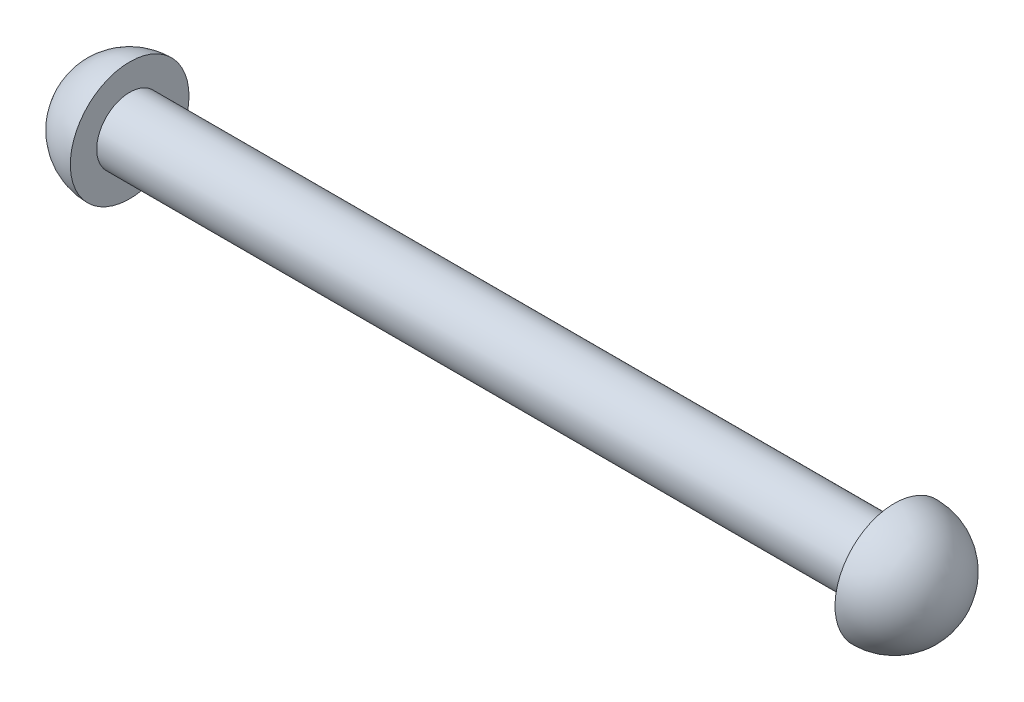
ISO-10303-21;
HEADER;
FILE_DESCRIPTION(('STEP AP214'),'2;1');
FILE_NAME('part.step','',(''),(''),'','','');
FILE_SCHEMA(('AUTOMOTIVE_DESIGN { 1 0 10303 214 1 1 1 1 }'));
ENDSEC;
DATA;
#1=APPLICATION_CONTEXT('core data for automotive mechanical design processes');
#2=APPLICATION_PROTOCOL_DEFINITION('international standard','automotive_design',2000,#1);
#3=PRODUCT_CONTEXT('',#1,'mechanical');
#4=PRODUCT('Part','Part','',(#3));
#5=PRODUCT_RELATED_PRODUCT_CATEGORY('part','',(#4));
#6=PRODUCT_DEFINITION_FORMATION('','',#4);
#7=PRODUCT_DEFINITION_CONTEXT('part definition',#1,'design');
#8=PRODUCT_DEFINITION('design','',#6,#7);
#9=PRODUCT_DEFINITION_SHAPE('','',#8);
#10=(LENGTH_UNIT() NAMED_UNIT(*) SI_UNIT(.MILLI.,.METRE.));
#11=(NAMED_UNIT(*) PLANE_ANGLE_UNIT() SI_UNIT($,.RADIAN.));
#12=(NAMED_UNIT(*) SI_UNIT($,.STERADIAN.) SOLID_ANGLE_UNIT());
#13=UNCERTAINTY_MEASURE_WITH_UNIT(LENGTH_MEASURE(1.E-05),#10,'distance_accuracy_value','');
#14=(GEOMETRIC_REPRESENTATION_CONTEXT(3) GLOBAL_UNCERTAINTY_ASSIGNED_CONTEXT((#13)) GLOBAL_UNIT_ASSIGNED_CONTEXT((#10,
#11,#12)) REPRESENTATION_CONTEXT('',''));
#15=CARTESIAN_POINT('',(0.,0.,0.));
#16=DIRECTION('',(0.,0.,1.));
#17=DIRECTION('',(1.,0.,0.));
#18=AXIS2_PLACEMENT_3D('',#15,#16,#17);
#19=CARTESIAN_POINT('',(36.83,3.175,0.));
#20=DIRECTION('',(-1.,0.,0.));
#21=DIRECTION('',(0.,0.,1.));
#22=AXIS2_PLACEMENT_3D('',#19,#20,#21);
#23=PLANE('',#22);
#24=CARTESIAN_POINT('',(36.83,0.,0.));
#25=DIRECTION('',(1.,0.,0.));
#26=DIRECTION('',(0.,0.,-1.));
#27=AXIS2_PLACEMENT_3D('',#24,#25,#26);
#28=CIRCLE('',#27,3.175);
#29=CARTESIAN_POINT('',(36.83,0.,-3.175));
#30=VERTEX_POINT('',#29);
#31=EDGE_CURVE('E58',#30,#30,#28,.T.);
#32=ORIENTED_EDGE('',*,*,#31,.T.);
#33=EDGE_LOOP('',(#32));
#34=FACE_BOUND('',#33,.T.);
#35=CARTESIAN_POINT('',(36.83,0.,0.));
#36=DIRECTION('',(1.,0.,0.));
#37=DIRECTION('',(0.,0.,-1.));
#38=AXIS2_PLACEMENT_3D('',#35,#36,#37);
#39=CIRCLE('',#38,5.715);
#40=CARTESIAN_POINT('',(36.83,0.,-5.715));
#41=VERTEX_POINT('',#40);
#42=EDGE_CURVE('E10',#41,#41,#39,.T.);
#43=ORIENTED_EDGE('',*,*,#42,.F.);
#44=EDGE_LOOP('',(#43));
#45=FACE_BOUND('',#44,.T.);
#46=ADVANCED_FACE('F41',(#34,#45),#23,.T.);
#47=CARTESIAN_POINT('',(36.83,0.,0.));
#48=DIRECTION('',(1.,0.,0.));
#49=DIRECTION('',(0.,-1.,0.));
#50=AXIS2_PLACEMENT_3D('',#47,#48,#49);
#51=SPHERICAL_SURFACE('',#50,5.715);
#52=ORIENTED_EDGE('',*,*,#42,.T.);
#53=EDGE_LOOP('',(#52));
#54=FACE_BOUND('',#53,.T.);
#55=ADVANCED_FACE('F78',(#54),#51,.T.);
#56=CARTESIAN_POINT('',(-36.83,0.,0.));
#57=DIRECTION('',(1.,0.,0.));
#58=DIRECTION('',(0.,1.,0.));
#59=AXIS2_PLACEMENT_3D('',#56,#57,#58);
#60=SPHERICAL_SURFACE('',#59,5.715);
#61=CARTESIAN_POINT('',(-36.83,0.,0.));
#62=DIRECTION('',(1.,0.,0.));
#63=DIRECTION('',(0.,0.,-1.));
#64=AXIS2_PLACEMENT_3D('',#61,#62,#63);
#65=CIRCLE('',#64,5.715);
#66=CARTESIAN_POINT('',(-36.83,0.,-5.715));
#67=VERTEX_POINT('',#66);
#68=EDGE_CURVE('E48',#67,#67,#65,.T.);
#69=ORIENTED_EDGE('',*,*,#68,.F.);
#70=EDGE_LOOP('',(#69));
#71=FACE_BOUND('',#70,.T.);
#72=ADVANCED_FACE('F75',(#71),#60,.T.);
#73=CARTESIAN_POINT('',(-36.83,3.175,0.));
#74=DIRECTION('',(1.,0.,0.));
#75=DIRECTION('',(0.,0.,-1.));
#76=AXIS2_PLACEMENT_3D('',#73,#74,#75);
#77=PLANE('',#76);
#78=ORIENTED_EDGE('',*,*,#68,.T.);
#79=EDGE_LOOP('',(#78));
#80=FACE_BOUND('',#79,.T.);
#81=CARTESIAN_POINT('',(-36.83,0.,0.));
#82=DIRECTION('',(1.,0.,0.));
#83=DIRECTION('',(0.,0.,-1.));
#84=AXIS2_PLACEMENT_3D('',#81,#82,#83);
#85=CIRCLE('',#84,3.175);
#86=CARTESIAN_POINT('',(-36.83,0.,-3.175));
#87=VERTEX_POINT('',#86);
#88=EDGE_CURVE('E53',#87,#87,#85,.T.);
#89=ORIENTED_EDGE('',*,*,#88,.F.);
#90=EDGE_LOOP('',(#89));
#91=FACE_BOUND('',#90,.T.);
#92=ADVANCED_FACE('F69',(#80,#91),#77,.T.);
#93=CARTESIAN_POINT('',(42.545,0.,0.));
#94=DIRECTION('',(1.,0.,0.));
#95=DIRECTION('',(0.,0.,-1.));
#96=AXIS2_PLACEMENT_3D('',#93,#94,#95);
#97=CYLINDRICAL_SURFACE('',#96,3.175);
#98=ORIENTED_EDGE('',*,*,#88,.T.);
#99=EDGE_LOOP('',(#98));
#100=FACE_BOUND('',#99,.T.);
#101=ORIENTED_EDGE('',*,*,#31,.F.);
#102=EDGE_LOOP('',(#101));
#103=FACE_BOUND('',#102,.T.);
#104=ADVANCED_FACE('F67',(#100,#103),#97,.T.);
#105=CLOSED_SHELL('',(#46,#55,#72,#92,#104));
#106=MANIFOLD_SOLID_BREP('B2',#105);
#107=ADVANCED_BREP_SHAPE_REPRESENTATION('',(#18,#106),#14);
#108=SHAPE_DEFINITION_REPRESENTATION(#9,#107);
ENDSEC;
END-ISO-10303-21;
